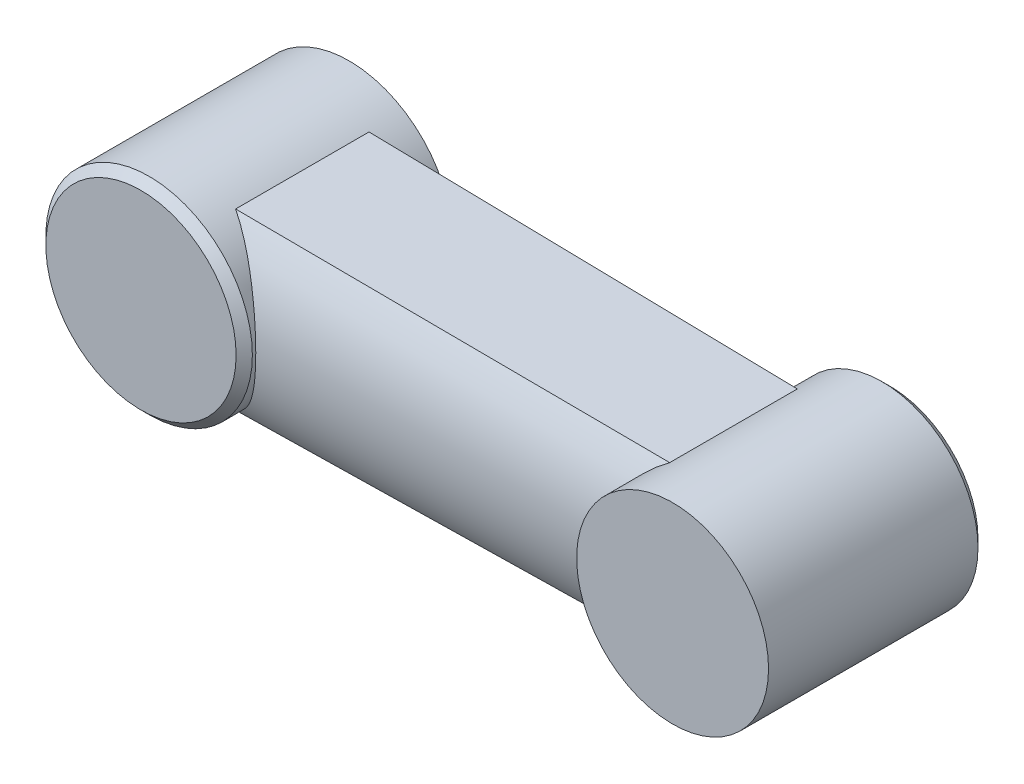
ISO-10303-21;
HEADER;
FILE_DESCRIPTION(('STEP AP214'),'2;1');
FILE_NAME('part.step','',(''),(''),'','','');
FILE_SCHEMA(('AUTOMOTIVE_DESIGN { 1 0 10303 214 1 1 1 1 }'));
ENDSEC;
DATA;
#1=APPLICATION_CONTEXT('core data for automotive mechanical design processes');
#2=APPLICATION_PROTOCOL_DEFINITION('international standard','automotive_design',2000,#1);
#3=PRODUCT_CONTEXT('',#1,'mechanical');
#4=PRODUCT('Part','Part','',(#3));
#5=PRODUCT_RELATED_PRODUCT_CATEGORY('part','',(#4));
#6=PRODUCT_DEFINITION_FORMATION('','',#4);
#7=PRODUCT_DEFINITION_CONTEXT('part definition',#1,'design');
#8=PRODUCT_DEFINITION('design','',#6,#7);
#9=PRODUCT_DEFINITION_SHAPE('','',#8);
#10=(LENGTH_UNIT() NAMED_UNIT(*) SI_UNIT(.MILLI.,.METRE.));
#11=(NAMED_UNIT(*) PLANE_ANGLE_UNIT() SI_UNIT($,.RADIAN.));
#12=(NAMED_UNIT(*) SI_UNIT($,.STERADIAN.) SOLID_ANGLE_UNIT());
#13=UNCERTAINTY_MEASURE_WITH_UNIT(LENGTH_MEASURE(1.E-05),#10,'distance_accuracy_value','');
#14=(GEOMETRIC_REPRESENTATION_CONTEXT(3) GLOBAL_UNCERTAINTY_ASSIGNED_CONTEXT((#13)) GLOBAL_UNIT_ASSIGNED_CONTEXT((#10,
#11,#12)) REPRESENTATION_CONTEXT('',''));
#15=CARTESIAN_POINT('',(0.,0.,0.));
#16=DIRECTION('',(0.,0.,1.));
#17=DIRECTION('',(1.,0.,0.));
#18=AXIS2_PLACEMENT_3D('',#15,#16,#17);
#19=CARTESIAN_POINT('',(0.,0.,-64.));
#20=DIRECTION('',(0.,0.,1.));
#21=DIRECTION('',(1.,0.,0.));
#22=AXIS2_PLACEMENT_3D('',#19,#20,#21);
#23=CYLINDRICAL_SURFACE('',#22,63.5);
#24=CARTESIAN_POINT('',(34.0875255524054,53.5750931097101,39.901123866366));
#25=CARTESIAN_POINT('',(34.8728416986949,53.0754082126081,40.2513861308099));
#26=CARTESIAN_POINT('',(35.6457519080938,52.5594024243077,40.606091688955));
#27=CARTESIAN_POINT('',(37.1664097322269,51.4953385414538,41.3217037799095));
#28=CARTESIAN_POINT('',(37.9141538902584,50.9472760718072,41.6826111543731));
#29=CARTESIAN_POINT('',(39.3840003749915,49.8197589503546,42.4078866666959));
#30=CARTESIAN_POINT('',(40.1060996697642,49.2403006070105,42.7722552073483));
#31=CARTESIAN_POINT('',(41.5240710890381,48.0505788313802,43.5018749105887));
#32=CARTESIAN_POINT('',(42.2199418112517,47.440313756108,43.86712611926));
#33=CARTESIAN_POINT('',(43.5905788765682,46.1842268316749,44.5991250340391));
#34=CARTESIAN_POINT('',(44.2651167639583,45.5381477669228,44.9658592435023));
#35=CARTESIAN_POINT('',(45.5860892461545,44.2157422798574,45.6952795922591));
#36=CARTESIAN_POINT('',(46.2325250074313,43.539417115376,46.0579658991088));
#37=CARTESIAN_POINT('',(47.4964560160919,42.1570128936726,46.7769558271872));
#38=CARTESIAN_POINT('',(48.1139522343661,41.4509348361395,47.1332596622928));
#39=CARTESIAN_POINT('',(49.319066591246,40.0095269998632,47.8372223998747));
#40=CARTESIAN_POINT('',(49.9066832170932,39.2741957434273,48.1848808641945));
#41=CARTESIAN_POINT('',(51.2438160286542,37.5221418648575,48.9846769921688));
#42=CARTESIAN_POINT('',(51.981148980518,36.4941088301045,49.4325362899803));
#43=CARTESIAN_POINT('',(53.3974608791348,34.3885306809019,50.3035128798274));
#44=CARTESIAN_POINT('',(54.0764394625069,33.3109852581957,50.7266300177848));
#45=CARTESIAN_POINT('',(55.3728334979026,31.1083957418215,51.5430185547397));
#46=CARTESIAN_POINT('',(55.9902447241766,29.9833483953351,51.9362879046565));
#47=CARTESIAN_POINT('',(57.1579385592235,27.6923712710274,52.6866555252858));
#48=CARTESIAN_POINT('',(57.7084391436257,26.5265910933806,53.0438705682438));
#49=CARTESIAN_POINT('',(58.7410229998343,24.1540044684972,53.7188075238164));
#50=CARTESIAN_POINT('',(59.2231088473443,22.9471995678961,54.0365309231713));
#51=CARTESIAN_POINT('',(60.115132294801,20.4968357103244,54.6279143533773));
#52=CARTESIAN_POINT('',(60.5250826100022,19.2532832760284,54.9015821491379));
#53=CARTESIAN_POINT('',(61.2258622697177,16.8816161027678,55.3715728935259));
#54=CARTESIAN_POINT('',(61.525015262513,15.7570053325782,55.5731979778693));
#55=CARTESIAN_POINT('',(62.0621728229516,13.486916106815,55.9363977060914));
#56=CARTESIAN_POINT('',(62.3001809188063,12.3414388593749,56.097974660827));
#57=CARTESIAN_POINT('',(62.7131653994027,10.0340665499779,56.3789845577492));
#58=CARTESIAN_POINT('',(62.8881428616507,8.87217176903093,56.4984182203731));
#59=CARTESIAN_POINT('',(63.1735457868664,6.53726220383556,56.6935033016067));
#60=CARTESIAN_POINT('',(63.2839959771694,5.36425185450201,56.7691714913633));
#61=CARTESIAN_POINT('',(63.4394854659217,3.01186006858332,56.8757573253076));
#62=CARTESIAN_POINT('',(63.4845232653367,1.8324784866124,56.9066739439383));
#63=CARTESIAN_POINT('',(63.5087682476126,-0.527139116364375,56.9233119378628));
#64=CARTESIAN_POINT('',(63.4879875060654,-1.70737494092318,56.9090416035137));
#65=CARTESIAN_POINT('',(63.4002337064968,-3.63687157900486,56.8488524992791));
#66=CARTESIAN_POINT('',(63.3527004538892,-4.38751712806003,56.8162570739209));
#67=CARTESIAN_POINT('',(63.2311090477269,-5.88570885248637,56.7329572454605));
#68=CARTESIAN_POINT('',(63.1570497737252,-6.63325489558636,56.6822520774113));
#69=CARTESIAN_POINT('',(62.9826851444603,-8.12368498947119,56.5630264041146));
#70=CARTESIAN_POINT('',(62.8823851271871,-8.8665699569932,56.4945095222105));
#71=CARTESIAN_POINT('',(62.6558690730822,-10.3466216662594,56.3400262572309));
#72=CARTESIAN_POINT('',(62.5296506008793,-11.0837878638919,56.2540582344057));
#73=CARTESIAN_POINT('',(62.2517639874001,-12.5509021782115,56.0651662741838));
#74=CARTESIAN_POINT('',(62.1001027544092,-13.2808521974362,55.9622469395897));
#75=CARTESIAN_POINT('',(61.7717823488949,-14.7326459947485,55.7399698208164));
#76=CARTESIAN_POINT('',(61.5951208447076,-15.4544890099463,55.6206105033809));
#77=CARTESIAN_POINT('',(61.217360617399,-16.8888935764164,55.3660773293602));
#78=CARTESIAN_POINT('',(61.0162632656874,-17.6014556460789,55.230904360298));
#79=CARTESIAN_POINT('',(60.5902141352028,-19.0163631609896,54.9454158803474));
#80=CARTESIAN_POINT('',(60.3652601789072,-19.7187076669599,54.7950989872529));
#81=CARTESIAN_POINT('',(59.6505318221485,-21.8237160402855,54.3191757414114));
#82=CARTESIAN_POINT('',(59.1248403438077,-23.2093914608956,53.9712705511763));
#83=CARTESIAN_POINT('',(57.9839729159312,-25.9284336527049,53.2230967705003));
#84=CARTESIAN_POINT('',(57.3687970007416,-27.2618004439809,52.8228282001576));
#85=CARTESIAN_POINT('',(56.0538397553098,-29.8723003374955,51.9766071094194));
#86=CARTESIAN_POINT('',(55.3539988997473,-31.1493930043824,51.5306224815));
#87=CARTESIAN_POINT('',(53.875253481758,-33.6423535704149,50.6005567398079));
#88=CARTESIAN_POINT('',(53.0963459251374,-34.8582191483283,50.1164741834528));
#89=CARTESIAN_POINT('',(51.3456749882489,-37.3976306123661,49.0452170990712));
#90=CARTESIAN_POINT('',(50.362328904306,-38.7111906318219,48.4532775492336));
#91=CARTESIAN_POINT('',(48.3041804975155,-41.2507998557215,47.2408083664554));
#92=CARTESIAN_POINT('',(47.2293600646791,-42.4768316426624,46.6202730833662));
#93=CARTESIAN_POINT('',(44.994490314296,-44.8373219798834,45.3632472705436));
#94=CARTESIAN_POINT('',(43.8345163997063,-45.9718597229656,44.7267711776823));
#95=CARTESIAN_POINT('',(41.4328631634707,-48.1476068236405,43.4500731763614));
#96=CARTESIAN_POINT('',(40.1912167096048,-49.1888533310852,42.8098528680654));
#97=CARTESIAN_POINT('',(38.1344220294306,-50.7836565269925,41.7896281964514));
#98=CARTESIAN_POINT('',(37.3441695215727,-51.3676107876423,41.4065671168528));
#99=CARTESIAN_POINT('',(35.7364145272882,-52.4987853172949,40.6477365047195));
#100=CARTESIAN_POINT('',(34.9189537613392,-53.0460582705289,40.2719570906765));
#101=CARTESIAN_POINT('',(34.0875255524053,-53.5750931097102,39.901123866366));
#102=B_SPLINE_CURVE_WITH_KNOTS('',3,(#24,#25,#26,#27,#28,#29,#30,#31,#32,#33,#34,#35,#36,#37,
#38,#39,#40,#41,#42,#43,#44,#45,#46,#47,#48,#49,#50,#51,#52,#53,#54,#55,#56,#57,#58,#59,#60,#61,
#62,#63,#64,#65,#66,#67,#68,#69,#70,#71,#72,#73,#74,#75,#76,#77,#78,#79,#80,#81,#82,#83,#84,#85,
#86,#87,#88,#89,#90,#91,#92,#93,#94,#95,#96,#97,#98,#99,#100,#101),.UNSPECIFIED.,.F.,.F.,(4,2,2,
2,2,2,2,2,2,2,2,2,2,2,2,2,2,2,2,2,2,2,2,2,2,2,2,2,2,2,2,2,2,2,2,2,2,2,4),(0.,2.98332471583376,
5.9670575499503,8.95114197701182,11.9353857198915,14.9448859745384,17.9542611905267,
20.9635353728338,23.9729617587502,27.9966721819526,32.0204076595553,36.0444191212616,
40.0549486332554,44.0653271152617,48.0749979823765,51.615830095113,55.1564578471892,
58.6970250695027,62.236234628405,65.775525292925,69.3141666487019,71.572109037435,
73.8301468118697,76.0877256044928,78.3455166227259,80.6026955888813,82.8600852109935,
85.1173482004254,87.374817400205,91.9367374731447,96.4986557951226,101.063800307899,
105.629117763649,110.857075639126,116.086070958338,121.310490620102,126.532820512648,
129.695776881275,132.854088479412),.UNSPECIFIED.);
#103=CARTESIAN_POINT('',(34.0875255524053,53.5750931097102,39.901123866366));
#104=VERTEX_POINT('',#103);
#105=CARTESIAN_POINT('',(34.0875255524053,-53.5750931097102,39.901123866366));
#106=VERTEX_POINT('',#105);
#107=EDGE_CURVE('E115',#104,#106,#102,.T.);
#108=ORIENTED_EDGE('',*,*,#107,.F.);
#109=DIRECTION('',(0.,0.,1.));
#110=VECTOR('',#109,1.);
#111=CARTESIAN_POINT('',(34.0875255524053,53.5750931097102,-64.));
#112=LINE('',#111,#110);
#113=CARTESIAN_POINT('',(34.0875255524053,53.5750931097102,-42.1394140955174));
#114=VERTEX_POINT('',#113);
#115=EDGE_CURVE('E183',#114,#104,#112,.T.);
#116=ORIENTED_EDGE('',*,*,#115,.F.);
#117=CARTESIAN_POINT('',(34.0875255524053,-53.5750931097102,-42.1394140955174));
#118=CARTESIAN_POINT('',(34.6070489229823,-53.2445389100125,-42.334882637009));
#119=CARTESIAN_POINT('',(35.1212066458949,-52.9067901087874,-42.5323149785162));
#120=CARTESIAN_POINT('',(36.1386321395676,-52.2171147666792,-42.9304152603627));
#121=CARTESIAN_POINT('',(36.6419001026892,-51.8651884765483,-43.1310831434385));
#122=CARTESIAN_POINT('',(38.1351016788967,-50.7884837174418,-43.7368895161274));
#123=CARTESIAN_POINT('',(39.1084924729786,-50.0427414803527,-44.1458532583939));
#124=CARTESIAN_POINT('',(41.0093265129066,-48.4972761823509,-44.9684663432524));
#125=CARTESIAN_POINT('',(41.9367674916235,-47.6975504625237,-45.3821159158052));
#126=CARTESIAN_POINT('',(43.749328007172,-46.0408786286366,-46.2113657781002));
#127=CARTESIAN_POINT('',(44.6341674583531,-45.1836244548227,-46.6269632817289));
#128=CARTESIAN_POINT('',(46.353723463192,-43.4177508485522,-47.4526135878866));
#129=CARTESIAN_POINT('',(47.1884411616891,-42.5091325902324,-47.8626665168941));
#130=CARTESIAN_POINT('',(48.8056823815175,-40.6421045934075,-48.6723824447514));
#131=CARTESIAN_POINT('',(49.5882046786395,-39.6836936879853,-49.0720451997722));
#132=CARTESIAN_POINT('',(51.10008183092,-37.7170102166117,-49.8569829386807));
#133=CARTESIAN_POINT('',(51.8293348289539,-36.7086480103418,-50.2422297054705));
#134=CARTESIAN_POINT('',(53.2304447984961,-34.645698070553,-50.9929332933545));
#135=CARTESIAN_POINT('',(53.9023019694719,-33.5911104977002,-51.3583901832229));
#136=CARTESIAN_POINT('',(55.185822954392,-31.4379676181106,-52.0650509138601));
#137=CARTESIAN_POINT('',(55.7974840153661,-30.3394103037188,-52.406253645207));
#138=CARTESIAN_POINT('',(56.9562091304579,-28.1037645870805,-53.0592848837396));
#139=CARTESIAN_POINT('',(57.5034226278785,-26.9667735209178,-53.3711809941749));
#140=CARTESIAN_POINT('',(58.5318499461043,-24.6550776536046,-53.9623971004071));
#141=CARTESIAN_POINT('',(59.0130651954082,-23.4803736694105,-54.2417178012626));
#142=CARTESIAN_POINT('',(59.9064149385316,-21.0971682630229,-54.7639190421848));
#143=CARTESIAN_POINT('',(60.3185572449597,-19.8886706811762,-55.0068037030831));
#144=CARTESIAN_POINT('',(61.0390031347694,-17.5459962606881,-55.4337629932465));
#145=CARTESIAN_POINT('',(61.3531476101824,-16.4142039156255,-55.6210776527687));
#146=CARTESIAN_POINT('',(61.919149260359,-14.1298761044509,-55.9599302603612));
#147=CARTESIAN_POINT('',(62.171008736096,-12.9773414063046,-56.11146953006));
#148=CARTESIAN_POINT('',(62.6106951459703,-10.6558212320018,-56.3767999025606));
#149=CARTESIAN_POINT('',(62.798522743702,-9.48683592646204,-56.4905913965612));
#150=CARTESIAN_POINT('',(63.1087130702369,-7.13748270439034,-56.6788684563125));
#151=CARTESIAN_POINT('',(63.2310995156664,-5.95711906959384,-56.7533682616893));
#152=CARTESIAN_POINT('',(63.4095790243943,-3.5895315952493,-56.8621065574091));
#153=CARTESIAN_POINT('',(63.4656709782761,-2.40230764123016,-56.8963443739808));
#154=CARTESIAN_POINT('',(63.5111074825608,-0.026216978466881,-56.9240728449856));
#155=CARTESIAN_POINT('',(63.5004621155403,1.16264945500151,-56.9175696545104));
#156=CARTESIAN_POINT('',(63.4277254825092,3.12719441421199,-56.8731961269407));
#157=CARTESIAN_POINT('',(63.3846508301167,3.90391299862703,-56.8469219329064));
#158=CARTESIAN_POINT('',(63.2700744515998,5.45453579386688,-56.7771111321624));
#159=CARTESIAN_POINT('',(63.1985714170876,6.22843987350235,-56.7335737309313));
#160=CARTESIAN_POINT('',(63.0273871875162,7.77182349366952,-56.6295001546979));
#161=CARTESIAN_POINT('',(62.9277110913236,8.54130380914185,-56.5689670556541));
#162=CARTESIAN_POINT('',(62.7004864068519,10.0747106236825,-56.4312452584072));
#163=CARTESIAN_POINT('',(62.572935193039,10.8386365925835,-56.3540549912881));
#164=CARTESIAN_POINT('',(62.2904038340495,12.359349678884,-56.1834879521289));
#165=CARTESIAN_POINT('',(62.1354313708006,13.1161387332754,-56.0901157135384));
#166=CARTESIAN_POINT('',(61.7984867967,14.6216320434426,-55.8876863540519));
#167=CARTESIAN_POINT('',(61.6165121487069,15.3703355323943,-55.7786277592862));
#168=CARTESIAN_POINT('',(61.226106887471,16.8583930857653,-55.5454357010636));
#169=CARTESIAN_POINT('',(61.017677972192,17.5977477468917,-55.4213032051452));
#170=CARTESIAN_POINT('',(60.5749313006101,19.0660950723717,-55.1586275676271));
#171=CARTESIAN_POINT('',(60.3406111691493,19.7950867791338,-55.0200831039987));
#172=CARTESIAN_POINT('',(59.5967562962069,21.9736183939978,-54.5821587610005));
#173=CARTESIAN_POINT('',(59.0486105909326,23.4060311715217,-54.2618600672826));
#174=CARTESIAN_POINT('',(57.8552921107319,26.2173255581269,-53.5723484643377));
#175=CARTESIAN_POINT('',(57.2101194122757,27.5962072093969,-53.2031355936617));
#176=CARTESIAN_POINT('',(55.8274837212358,30.2959362902032,-52.4225474923739));
#177=CARTESIAN_POINT('',(55.0899465183107,31.6167358875834,-52.0111384078368));
#178=CARTESIAN_POINT('',(53.528225656365,34.1943017388064,-51.1539620840156));
#179=CARTESIAN_POINT('',(52.7040392913014,35.4510659910123,-50.708193771813));
#180=CARTESIAN_POINT('',(50.8662899873879,38.0487403824544,-49.7330661572848));
#181=CARTESIAN_POINT('',(49.8419211306735,39.3806994953773,-49.2002029677461));
#182=CARTESIAN_POINT('',(47.6957644418796,41.9544091195498,-48.1124396922618));
#183=CARTESIAN_POINT('',(46.5739563529866,43.196140774239,-47.5575350371523));
#184=CARTESIAN_POINT('',(44.2399998519241,45.5835042025916,-46.4385898174968));
#185=CARTESIAN_POINT('',(43.0279707709924,46.7292588005649,-45.8745620666235));
#186=CARTESIAN_POINT('',(40.5173174024619,48.9221124661703,-44.749480926731));
#187=CARTESIAN_POINT('',(39.2187356476239,49.9692593889151,-44.188426220939));
#188=CARTESIAN_POINT('',(37.2638797458986,51.4221818244556,-43.3817245133034));
#189=CARTESIAN_POINT('',(36.6400722353196,51.8685334804043,-43.1296079661983));
#190=CARTESIAN_POINT('',(35.3761310866709,52.7386673262228,-42.6304533808489));
#191=CARTESIAN_POINT('',(34.7360175493161,53.1624754870219,-42.3834097092511));
#192=CARTESIAN_POINT('',(34.0875255524053,53.5750931097102,-42.1394140955174));
#193=B_SPLINE_CURVE_WITH_KNOTS('',3,(#117,#118,#119,#120,#121,#122,#123,#124,#125,#126,#127,
#128,#129,#130,#131,#132,#133,#134,#135,#136,#137,#138,#139,#140,#141,#142,#143,#144,#145,#146,
#147,#148,#149,#150,#151,#152,#153,#154,#155,#156,#157,#158,#159,#160,#161,#162,#163,#164,#165,
#166,#167,#168,#169,#170,#171,#172,#173,#174,#175,#176,#177,#178,#179,#180,#181,#182,#183,#184,
#185,#186,#187,#188,#189,#190,#191,#192),.UNSPECIFIED.,.F.,.F.,(4,2,2,2,2,2,2,2,2,2,2,2,2,2,2,2,
2,2,2,2,2,2,2,2,2,2,2,2,2,2,2,2,2,2,2,2,2,4),(0.,1.93800436682585,3.87597447190296,
7.75169287544148,11.6276023139586,15.526241635063,19.4247918727818,23.3234335163332,
27.2293446012244,31.1352421113665,35.0413181683906,38.9381504973661,42.8348984680657,
46.7312053928081,50.2972087641048,53.8630803780728,57.4289150360019,60.9934565170458,
64.5580576486748,68.1221202585612,70.4565380045493,72.7910632022114,75.1251661589724,
77.4594890577444,79.793159039877,82.1270484340473,84.4607881035007,86.7947420390453,
91.4898205633479,96.1848953873174,100.883766970143,105.582785341777,110.865742160623,
116.149799903439,121.426988769977,126.701603230317,129.123447786643,131.542439016917),.UNSPECIFIED.);
#194=CARTESIAN_POINT('',(34.0875255524053,-53.5750931097102,-42.1394140955174));
#195=VERTEX_POINT('',#194);
#196=EDGE_CURVE('E100',#195,#114,#193,.T.);
#197=ORIENTED_EDGE('',*,*,#196,.F.);
#198=DIRECTION('',(0.,0.,1.));
#199=VECTOR('',#198,1.);
#200=CARTESIAN_POINT('',(34.0875255524053,-53.5750931097102,-64.));
#201=LINE('',#200,#199);
#202=EDGE_CURVE('E119',#106,#195,#201,.F.);
#203=ORIENTED_EDGE('',*,*,#202,.F.);
#204=EDGE_LOOP('',(#108,#116,#197,#203));
#205=FACE_BOUND('',#204,.T.);
#206=CARTESIAN_POINT('',(0.,0.,59.));
#207=DIRECTION('',(0.,0.,1.));
#208=DIRECTION('',(1.,0.,0.));
#209=AXIS2_PLACEMENT_3D('',#206,#207,#208);
#210=CIRCLE('',#209,63.5);
#211=CARTESIAN_POINT('',(63.5,0.,59.));
#212=VERTEX_POINT('',#211);
#213=EDGE_CURVE('E175',#212,#212,#210,.F.);
#214=ORIENTED_EDGE('',*,*,#213,.T.);
#215=EDGE_LOOP('',(#214));
#216=FACE_BOUND('',#215,.T.);
#217=CARTESIAN_POINT('',(0.,0.,-64.));
#218=DIRECTION('',(0.,0.,1.));
#219=DIRECTION('',(1.,0.,0.));
#220=AXIS2_PLACEMENT_3D('',#217,#218,#219);
#221=CIRCLE('',#220,63.5);
#222=CARTESIAN_POINT('',(63.5,0.,-64.));
#223=VERTEX_POINT('',#222);
#224=EDGE_CURVE('E103',#223,#223,#221,.T.);
#225=ORIENTED_EDGE('',*,*,#224,.T.);
#226=EDGE_LOOP('',(#225));
#227=FACE_BOUND('',#226,.T.);
#228=ADVANCED_FACE('F50',(#205,#216,#227),#23,.T.);
#229=CARTESIAN_POINT('',(0.,0.,-64.));
#230=DIRECTION('',(0.,0.,1.));
#231=DIRECTION('',(1.,0.,0.));
#232=AXIS2_PLACEMENT_3D('',#229,#230,#231);
#233=PLANE('',#232);
#234=ORIENTED_EDGE('',*,*,#224,.F.);
#235=EDGE_LOOP('',(#234));
#236=FACE_BOUND('',#235,.T.);
#237=ADVANCED_FACE('F187',(#236),#233,.F.);
#238=CARTESIAN_POINT('',(0.,0.,64.));
#239=DIRECTION('',(0.,0.,1.));
#240=DIRECTION('',(1.,0.,0.));
#241=AXIS2_PLACEMENT_3D('',#238,#239,#240);
#242=PLANE('',#241);
#243=CARTESIAN_POINT('',(0.,0.,64.));
#244=DIRECTION('',(0.,0.,1.));
#245=DIRECTION('',(1.,0.,0.));
#246=AXIS2_PLACEMENT_3D('',#243,#244,#245);
#247=CIRCLE('',#246,58.5);
#248=CARTESIAN_POINT('',(58.5,0.,64.));
#249=VERTEX_POINT('',#248);
#250=EDGE_CURVE('E172',#249,#249,#247,.T.);
#251=ORIENTED_EDGE('',*,*,#250,.T.);
#252=EDGE_LOOP('',(#251));
#253=FACE_BOUND('',#252,.T.);
#254=ADVANCED_FACE('F195',(#253),#242,.T.);
#255=CARTESIAN_POINT('',(0.,0.,64.));
#256=DIRECTION('',(0.,0.,-1.));
#257=DIRECTION('',(-1.,0.,0.));
#258=AXIS2_PLACEMENT_3D('',#255,#256,#257);
#259=CONICAL_SURFACE('',#258,58.5,0.785398163397448);
#260=ORIENTED_EDGE('',*,*,#213,.F.);
#261=EDGE_LOOP('',(#260));
#262=FACE_BOUND('',#261,.T.);
#263=ORIENTED_EDGE('',*,*,#250,.F.);
#264=EDGE_LOOP('',(#263));
#265=FACE_BOUND('',#264,.T.);
#266=ADVANCED_FACE('F190',(#262,#265),#259,.T.);
#267=CARTESIAN_POINT('',(0.,54.,40.1203836734958));
#268=CARTESIAN_POINT('',(330.2,49.884,37.9964516150382));
#269=CARTESIAN_POINT('',(0.,20.639458431767,64.4313532901268));
#270=CARTESIAN_POINT('',(330.2,18.8682198581626,59.4920387123253));
#271=CARTESIAN_POINT('',(0.,-20.639458431767,64.4313532901268));
#272=CARTESIAN_POINT('',(330.2,-18.8682198581626,59.4920387123253));
#273=CARTESIAN_POINT('',(0.,-54.,40.1203836734958));
#274=CARTESIAN_POINT('',(330.2,-49.884,37.9964516150382));
#275=(BOUNDED_SURFACE() B_SPLINE_SURFACE(3,1,((#267,#268),(#269,#270),(#271,#272),(#273,#274)),
.UNSPECIFIED.,.F.,.F.,.F.) B_SPLINE_SURFACE_WITH_KNOTS((4,4),(2,2),(0.,1.),(0.,1.),
.UNSPECIFIED.) GEOMETRIC_REPRESENTATION_ITEM() RATIONAL_B_SPLINE_SURFACE(((1.,1.),
(0.87211590650535,0.881270205933418),(0.87211590650535,0.881270205933418),(1.,1.))) REPRESENTATION_ITEM('') SURFACE());
#276=CARTESIAN_POINT('',(299.312687676527,50.2690156799619,38.1951268204998));
#277=CARTESIAN_POINT('',(298.820120806813,49.9663578347433,38.4134000794214));
#278=CARTESIAN_POINT('',(298.332612658844,49.656844969285,38.633477572108));
#279=CARTESIAN_POINT('',(297.367809237707,49.02428085137,39.0765154992185));
#280=CARTESIAN_POINT('',(296.890513785287,48.7012298368274,39.2994758829322));
#281=CARTESIAN_POINT('',(295.473998333577,47.7119649212693,39.9716358587943));
#282=CARTESIAN_POINT('',(294.550217685801,47.0256812361216,40.4240837551873));
#283=CARTESIAN_POINT('',(292.745175404169,45.6010775788342,41.3319625019481));
#284=CARTESIAN_POINT('',(291.863917758554,44.8627527416653,41.7873936275813));
#285=CARTESIAN_POINT('',(290.13834707711,43.3290564407837,42.6996508279235));
#286=CARTESIAN_POINT('',(289.29439257469,42.533270054574,43.1564581497346));
#287=CARTESIAN_POINT('',(287.652901578261,40.8912220733986,44.0625494508173));
#288=CARTESIAN_POINT('',(286.855362717034,40.0449630570236,44.5118338129291));
#289=CARTESIAN_POINT('',(285.308666103534,38.3030642954282,45.3979438127693));
#290=CARTESIAN_POINT('',(284.559509445695,37.4074234340116,45.8347691685432));
#291=CARTESIAN_POINT('',(283.11004864772,35.5656205835682,46.6922408527991));
#292=CARTESIAN_POINT('',(282.40987965422,34.6193306336959,47.1128410899132));
#293=CARTESIAN_POINT('',(281.063319625469,32.6799658122892,47.931836764835));
#294=CARTESIAN_POINT('',(280.416928804059,31.6868907547458,48.3302321143463));
#295=CARTESIAN_POINT('',(279.180927785604,29.6558177270077,49.1001237017089));
#296=CARTESIAN_POINT('',(278.591321426935,28.6178167268845,49.4716181207571));
#297=CARTESIAN_POINT('',(277.474005075588,26.5027413370472,50.1819244200731));
#298=CARTESIAN_POINT('',(276.946104836484,25.4258012092224,50.5208361499374));
#299=CARTESIAN_POINT('',(275.953485570861,23.2328253375399,51.1628493162913));
#300=CARTESIAN_POINT('',(275.488764219942,22.1167910338886,51.4659520701675));
#301=CARTESIAN_POINT('',(274.62600163408,19.8494707663928,52.0320943547575));
#302=CARTESIAN_POINT('',(274.22794926837,18.6981907250644,52.2951405724713));
#303=CARTESIAN_POINT('',(273.542763867682,16.4964495577758,52.7501192120954));
#304=CARTESIAN_POINT('',(273.248183588365,15.4492670077206,52.9467264785171));
#305=CARTESIAN_POINT('',(272.716216319856,13.334294822864,53.3029716022107));
#306=CARTESIAN_POINT('',(272.478826174298,12.2665063288353,53.4626114997212));
#307=CARTESIAN_POINT('',(272.063098455218,10.1144313514259,53.7428737780346));
#308=CARTESIAN_POINT('',(271.884760090293,9.03014508934996,53.8634966817379));
#309=CARTESIAN_POINT('',(271.588690376203,6.85009466131849,54.0640721958229));
#310=CARTESIAN_POINT('',(271.470930692282,5.75433610651894,54.1440438200152));
#311=CARTESIAN_POINT('',(271.296916452338,3.55569153106458,54.262308461463));
#312=CARTESIAN_POINT('',(271.240663146647,2.45280536597458,54.3006006314377));
#313=CARTESIAN_POINT('',(271.190182607052,0.245091326751467,54.3349597428531));
#314=CARTESIAN_POINT('',(271.195943690633,-0.859736142462828,54.3310346373507));
#315=CARTESIAN_POINT('',(271.256049562939,-2.66558563354039,54.2901316015457));
#316=CARTESIAN_POINT('',(271.291996265653,-3.36758385381328,54.265671141915));
#317=CARTESIAN_POINT('',(271.388871271417,-4.76911401235845,54.1998062701185));
#318=CARTESIAN_POINT('',(271.449800627507,-5.46864584541663,54.1584011437204));
#319=CARTESIAN_POINT('',(271.596410677616,-6.86376182540017,54.0588862164579));
#320=CARTESIAN_POINT('',(271.682086330823,-7.55934674691621,54.0007798176487));
#321=CARTESIAN_POINT('',(271.877902893667,-8.94555803867696,53.8681739833133));
#322=CARTESIAN_POINT('',(271.988046121262,-9.63618393272014,53.7936729946368));
#323=CARTESIAN_POINT('',(272.232388194927,-11.0110560172365,53.6287055691793));
#324=CARTESIAN_POINT('',(272.366580869766,-11.6953037970957,53.5382432282671));
#325=CARTESIAN_POINT('',(272.658613480961,-13.0565490911452,53.3418112392498));
#326=CARTESIAN_POINT('',(272.816455656163,-13.7335459123942,53.2358401229843));
#327=CARTESIAN_POINT('',(273.155277081082,-15.0791535663315,53.0089474262153));
#328=CARTESIAN_POINT('',(273.336254945411,-15.7477648985211,52.8880267409216));
#329=CARTESIAN_POINT('',(273.720811956228,-17.0756949541013,52.6318395421638));
#330=CARTESIAN_POINT('',(273.924393175295,-17.7350128190859,52.4965717132128));
#331=CARTESIAN_POINT('',(274.569750220916,-19.7023893200417,52.0691858278858));
#332=CARTESIAN_POINT('',(275.044958137382,-20.9951945555455,51.7562800957339));
#333=CARTESIAN_POINT('',(276.079148768671,-23.5332142247924,51.0811399121009));
#334=CARTESIAN_POINT('',(276.638130973782,-24.7784289480348,50.7189057607522));
#335=CARTESIAN_POINT('',(277.83526770372,-27.2172933061357,49.9511387908823));
#336=CARTESIAN_POINT('',(278.47346969722,-28.4109114411095,49.5455800326443));
#337=CARTESIAN_POINT('',(279.823902148166,-30.7418849759217,48.6979513969692));
#338=CARTESIAN_POINT('',(280.536135663972,-31.8792380484951,48.2558800112933));
#339=CARTESIAN_POINT('',(282.133986752992,-34.2487097990162,47.2784630114741));
#340=CARTESIAN_POINT('',(283.02994489474,-35.4720373390486,46.7386920376435));
#341=CARTESIAN_POINT('',(284.906287261798,-37.8386142499545,45.6307013195817));
#342=CARTESIAN_POINT('',(285.886686434614,-38.9818493778844,45.062476546025));
#343=CARTESIAN_POINT('',(287.926249615067,-41.184729425972,43.9084603714603));
#344=CARTESIAN_POINT('',(288.985367571049,-42.2444224832408,43.3226793589708));
#345=CARTESIAN_POINT('',(291.178518409908,-44.2782104360038,42.144263720143));
#346=CARTESIAN_POINT('',(292.31252610327,-45.2523338589487,41.5516314530284));
#347=CARTESIAN_POINT('',(294.410671313402,-46.9204621095445,40.4928809665539));
#348=CARTESIAN_POINT('',(295.361474472024,-47.6307497053919,40.02593092383));
#349=CARTESIAN_POINT('',(296.819719451061,-48.6529382250736,39.332675598009));
#350=CARTESIAN_POINT('',(297.310692806757,-48.9861849116742,39.1029854285058));
#351=CARTESIAN_POINT('',(298.303551868008,-49.6383855913537,38.6466005351544));
#352=CARTESIAN_POINT('',(298.805439538141,-49.9573369791174,38.4199063625918));
#353=CARTESIAN_POINT('',(299.312687676527,-50.2690156799619,38.1951268204998));
#354=B_SPLINE_CURVE_WITH_KNOTS('',3,(#276,#277,#278,#279,#280,#281,#282,#283,#284,#285,#286,
#287,#288,#289,#290,#291,#292,#293,#294,#295,#296,#297,#298,#299,#300,#301,#302,#303,#304,#305,
#306,#307,#308,#309,#310,#311,#312,#313,#314,#315,#316,#317,#318,#319,#320,#321,#322,#323,#324,
#325,#326,#327,#328,#329,#330,#331,#332,#333,#334,#335,#336,#337,#338,#339,#340,#341,#342,#343,
#344,#345,#346,#347,#348,#349,#350,#351,#352,#353),.UNSPECIFIED.,.F.,.F.,(4,2,2,2,2,2,2,2,2,2,2,
2,2,2,2,2,2,2,2,2,2,2,2,2,2,2,2,2,2,2,2,2,2,2,2,2,2,2,4),(0.,1.85372891395322,3.70742526484892,
7.41507546536314,11.1230727337323,14.861210620055,18.5991576923723,22.3371892895518,
26.0851568490709,29.8331393110889,33.5813749423982,37.3177312549254,41.0539500667515,
44.7895444723798,48.1037110241561,51.4176946226063,54.7316338056733,58.0440215314276,
61.3564765918003,64.6683076497551,66.7777514228669,68.8872841200027,70.9963874087435,
73.1056905905938,75.2144532858214,77.3234157393559,79.4322519651267,81.5412817171143,
85.7739638499756,90.006620230783,94.2418251836697,98.4772051691092,103.301087881716,
108.125826265877,112.947763992438,117.768088017677,121.592112834893,123.500752146939,
125.409737905296),.UNSPECIFIED.);
#355=CARTESIAN_POINT('',(299.312687676527,50.2690156799619,38.1951268204997));
#356=VERTEX_POINT('',#355);
#357=CARTESIAN_POINT('',(299.312687676527,-50.2690156799619,38.1951268204998));
#358=VERTEX_POINT('',#357);
#359=EDGE_CURVE('E73',#356,#358,#354,.T.);
#360=DIRECTION('',(-0.999901637269904,0.0124639465142425,0.00643162671926648));
#361=VECTOR('',#360,1.);
#362=CARTESIAN_POINT('',(165.1,51.942,39.058417644267));
#363=LINE('',#362,#361);
#364=EDGE_CURVE('E109',#356,#104,#363,.T.);
#365=DIRECTION('',(0.999901637269904,0.0124639465142426,-0.00643162671926648));
#366=VECTOR('',#365,1.);
#367=CARTESIAN_POINT('',(165.1,-51.942,39.058417644267));
#368=LINE('',#367,#366);
#369=EDGE_CURVE('E168',#106,#358,#368,.T.);
#370=ORIENTED_EDGE('',*,*,#359,.F.);
#371=ORIENTED_EDGE('',*,*,#364,.T.);
#372=ORIENTED_EDGE('',*,*,#107,.T.);
#373=ORIENTED_EDGE('',*,*,#369,.T.);
#374=EDGE_LOOP('',(#370,#371,#372,#373));
#375=FACE_BOUND('',#374,.T.);
#376=ADVANCED_FACE('F147',(#375),#275,.T.);
#377=CARTESIAN_POINT('',(0.673014748235981,-53.9916107549857,0.));
#378=DIRECTION('',(0.0124642043129388,-0.999922318788237,0.));
#379=DIRECTION('',(0.999922318788237,0.0124642043129388,0.));
#380=AXIS2_PLACEMENT_3D('',#377,#378,#379);
#381=PLANE('',#380);
#382=DIRECTION('',(0.,0.,1.));
#383=VECTOR('',#382,1.);
#384=CARTESIAN_POINT('',(299.312687676527,-50.2690156799619,-66.5));
#385=LINE('',#384,#383);
#386=CARTESIAN_POINT('',(299.312687676527,-50.2690156799619,-40.2704701160511));
#387=VERTEX_POINT('',#386);
#388=EDGE_CURVE('E66',#358,#387,#385,.F.);
#389=ORIENTED_EDGE('',*,*,#388,.F.);
#390=ORIENTED_EDGE('',*,*,#369,.F.);
#391=ORIENTED_EDGE('',*,*,#202,.T.);
#392=DIRECTION('',(0.99989749799021,0.0124638949174067,0.00704590919649516));
#393=VECTOR('',#392,1.);
#394=CARTESIAN_POINT('',(0.,-54.,-42.3796163265043));
#395=LINE('',#394,#393);
#396=EDGE_CURVE('E104',#195,#387,#395,.T.);
#397=ORIENTED_EDGE('',*,*,#396,.T.);
#398=EDGE_LOOP('',(#389,#390,#391,#397));
#399=FACE_BOUND('',#398,.T.);
#400=ADVANCED_FACE('F201',(#399),#381,.T.);
#401=CARTESIAN_POINT('',(0.673014748235979,53.9916107549857,0.));
#402=DIRECTION('',(0.0124642043129387,0.999922318788237,0.));
#403=DIRECTION('',(-0.999922318788237,0.0124642043129387,0.));
#404=AXIS2_PLACEMENT_3D('',#401,#402,#403);
#405=PLANE('',#404);
#406=DIRECTION('',(0.,0.,1.));
#407=VECTOR('',#406,1.);
#408=CARTESIAN_POINT('',(299.312687676527,50.2690156799619,-66.5));
#409=LINE('',#408,#407);
#410=CARTESIAN_POINT('',(299.312687676527,50.2690156799619,-40.2704701160511));
#411=VERTEX_POINT('',#410);
#412=EDGE_CURVE('E107',#411,#356,#409,.T.);
#413=ORIENTED_EDGE('',*,*,#412,.F.);
#414=DIRECTION('',(0.99989749799021,-0.0124638949174067,0.0070459091964952));
#415=VECTOR('',#414,1.);
#416=CARTESIAN_POINT('',(165.1,51.942,-41.2162174674417));
#417=LINE('',#416,#415);
#418=EDGE_CURVE('E94',#114,#411,#417,.T.);
#419=ORIENTED_EDGE('',*,*,#418,.F.);
#420=ORIENTED_EDGE('',*,*,#115,.T.);
#421=ORIENTED_EDGE('',*,*,#364,.F.);
#422=EDGE_LOOP('',(#413,#419,#420,#421));
#423=FACE_BOUND('',#422,.T.);
#424=ADVANCED_FACE('F108',(#423),#405,.T.);
#425=CARTESIAN_POINT('',(0.,-54.,-42.3796163265043));
#426=CARTESIAN_POINT('',(330.2,-49.884,-40.0528186083791));
#427=CARTESIAN_POINT('',(0.,-19.987417175028,-63.382749209216));
#428=CARTESIAN_POINT('',(330.2,-18.3025305396578,-58.5606894569099));
#429=CARTESIAN_POINT('',(0.,19.9874171750281,-63.382749209216));
#430=CARTESIAN_POINT('',(330.2,18.3025305396578,-58.5606894569099));
#431=CARTESIAN_POINT('',(0.,54.,-42.3796163265043));
#432=CARTESIAN_POINT('',(330.2,49.884,-40.0528186083791));
#433=(BOUNDED_SURFACE() B_SPLINE_SURFACE(3,1,((#425,#426),(#427,#428),(#429,#430),(#431,#432)),
.UNSPECIFIED.,.F.,.F.,.F.) B_SPLINE_SURFACE_WITH_KNOTS((4,4),(2,2),(0.,1.),(0.,1.),
.UNSPECIFIED.) GEOMETRIC_REPRESENTATION_ITEM() RATIONAL_B_SPLINE_SURFACE(((1.,1.),
(0.900566583584842,0.908508250483209),(0.900566583584842,0.908508250483209),(1.,1.))) REPRESENTATION_ITEM('') SURFACE());
#434=CARTESIAN_POINT('',(299.312687676527,-50.2690156799619,-40.2704701160511));
#435=CARTESIAN_POINT('',(298.335975569884,-49.6688535816304,-40.6381371659844));
#436=CARTESIAN_POINT('',(297.378705086664,-49.041484377802,-41.0128156425435));
#437=CARTESIAN_POINT('',(295.504602658758,-47.7340097673958,-41.7713215289791));
#438=CARTESIAN_POINT('',(294.587771850855,-47.0539028798147,-42.1551491955776));
#439=CARTESIAN_POINT('',(292.79611819661,-45.6426325860991,-42.9270759674216));
#440=CARTESIAN_POINT('',(291.921297271237,-44.911466848962,-43.3151752669988));
#441=CARTESIAN_POINT('',(290.210543880902,-43.3953582120682,-44.0931929433399));
#442=CARTESIAN_POINT('',(289.374858709243,-42.6101351414452,-44.4831092273449));
#443=CARTESIAN_POINT('',(287.749527949137,-40.9911341227182,-45.2580118428076));
#444=CARTESIAN_POINT('',(286.959881401725,-40.1573571866943,-45.6429982768216));
#445=CARTESIAN_POINT('',(285.428602760093,-38.4427260185084,-46.4036595786873));
#446=CARTESIAN_POINT('',(284.686971770081,-37.5618707045413,-46.7793342322747));
#447=CARTESIAN_POINT('',(283.252700504592,-35.7531195834613,-47.5177330120793));
#448=CARTESIAN_POINT('',(282.560149172866,-34.8251433536802,-47.8804330647161));
#449=CARTESIAN_POINT('',(281.227936846617,-32.9254144080206,-48.5879801266821));
#450=CARTESIAN_POINT('',(280.588275647547,-31.953661861466,-48.9328272050544));
#451=CARTESIAN_POINT('',(279.364461061081,-29.9684448313071,-49.6005893981313));
#452=CARTESIAN_POINT('',(278.780310192976,-28.9549784575437,-49.9235035172371));
#453=CARTESIAN_POINT('',(277.671598543569,-26.8911881964575,-50.5427135560777));
#454=CARTESIAN_POINT('',(277.146907072498,-25.84095205615,-50.8390675417414));
#455=CARTESIAN_POINT('',(276.158494985725,-23.7044522886695,-51.4021740786817));
#456=CARTESIAN_POINT('',(275.694773055586,-22.6181894388251,-51.6689272680994));
#457=CARTESIAN_POINT('',(274.831205434489,-20.4131874539444,-52.1692435462884));
#458=CARTESIAN_POINT('',(274.431352873152,-19.294451827299,-52.40281020461));
#459=CARTESIAN_POINT('',(273.728331084572,-17.1214923093326,-52.815829752212));
#460=CARTESIAN_POINT('',(273.419920735117,-16.069507333281,-52.9981503308905));
#461=CARTESIAN_POINT('',(272.86118240408,-13.9451120926462,-53.329841673411));
#462=CARTESIAN_POINT('',(272.610852354609,-12.8727025567299,-53.4792136103461));
#463=CARTESIAN_POINT('',(272.169991190088,-10.711416264295,-53.7430965864713));
#464=CARTESIAN_POINT('',(271.979459628575,-9.62253963078556,-53.8576078859357));
#465=CARTESIAN_POINT('',(271.659649545178,-7.43308623707634,-54.0502170138142));
#466=CARTESIAN_POINT('',(271.530345201945,-6.3325146095837,-54.1283301921832));
#467=CARTESIAN_POINT('',(271.33385158011,-4.12382136030305,-54.2471597502153));
#468=CARTESIAN_POINT('',(271.266663216151,-3.01569962758363,-54.2878755792116));
#469=CARTESIAN_POINT('',(271.194942170532,-0.796789866658988,-54.3313404041996));
#470=CARTESIAN_POINT('',(271.190399838716,0.31399772452329,-54.3340952477991));
#471=CARTESIAN_POINT('',(271.234698751428,2.14964630893581,-54.307246716762));
#472=CARTESIAN_POINT('',(271.265627400437,2.87516794879554,-54.288500799741));
#473=CARTESIAN_POINT('',(271.354190105184,4.32404114532444,-54.2348729249697));
#474=CARTESIAN_POINT('',(271.411825390272,5.04739260055362,-54.1999902244171));
#475=CARTESIAN_POINT('',(271.553600232462,6.49040358553472,-54.1142980035584));
#476=CARTESIAN_POINT('',(271.637734995987,7.21006375910536,-54.063491363794));
#477=CARTESIAN_POINT('',(271.832246880494,8.64461572792847,-53.9462384288863));
#478=CARTESIAN_POINT('',(271.942626490986,9.3595070642053,-53.8797906500761));
#479=CARTESIAN_POINT('',(272.189241418677,10.7830215819241,-53.7316565589215));
#480=CARTESIAN_POINT('',(272.325469781951,11.4916463956698,-53.6499743450999));
#481=CARTESIAN_POINT('',(272.623396558611,12.9017079607888,-53.4718096550901));
#482=CARTESIAN_POINT('',(272.785097397471,13.6031440208723,-53.3753257695184));
#483=CARTESIAN_POINT('',(273.133477014589,14.997611132847,-53.1680959255201));
#484=CARTESIAN_POINT('',(273.320154098404,15.6906427514378,-53.0573509346162));
#485=CARTESIAN_POINT('',(273.717966796912,17.0673236978744,-52.822190014925));
#486=CARTESIAN_POINT('',(273.929104664187,17.7509721551342,-52.6977728271247));
#487=CARTESIAN_POINT('',(274.598294071917,19.7860702367737,-52.3050189318961));
#488=CARTESIAN_POINT('',(275.092247941927,21.1221773395788,-52.0171041956242));
#489=CARTESIAN_POINT('',(276.170842736542,23.7457959123082,-51.3949470664336));
#490=CARTESIAN_POINT('',(276.755483111436,25.0333076767415,-51.0607049543365));
#491=CARTESIAN_POINT('',(278.010961895125,27.5552087515094,-50.3519370193687));
#492=CARTESIAN_POINT('',(278.681859495415,28.7895607987394,-49.9773835630423));
#493=CARTESIAN_POINT('',(280.104619296048,31.1995407750547,-49.1949162180584));
#494=CARTESIAN_POINT('',(280.856484305544,32.375166664572,-48.7870011720437));
#495=CARTESIAN_POINT('',(282.530447724821,34.7999173011408,-47.8947601570599));
#496=CARTESIAN_POINT('',(283.462158827111,36.0411905841153,-47.4071127590204));
#497=CARTESIAN_POINT('',(285.415413855614,38.4413261439663,-46.4088545422514));
#498=CARTESIAN_POINT('',(286.436974377745,39.6001731242358,-45.8982394897552));
#499=CARTESIAN_POINT('',(288.56357286922,41.8303707230884,-44.8650993749568));
#500=CARTESIAN_POINT('',(289.66852947996,42.9018045484005,-44.3425862589116));
#501=CARTESIAN_POINT('',(291.957903797772,44.9544711892793,-43.2962134799073));
#502=CARTESIAN_POINT('',(293.142288606132,45.9357409559879,-42.7723544598261));
#503=CARTESIAN_POINT('',(295.158522567477,47.4773039405652,-41.9163517467695));
#504=CARTESIAN_POINT('',(295.968583139927,48.0646837738951,-41.5813130746368));
#505=CARTESIAN_POINT('',(297.61837283868,49.1979357311961,-40.9192285112308));
#506=CARTESIAN_POINT('',(298.458055139781,49.7438694135281,-40.5921712759582));
#507=CARTESIAN_POINT('',(299.312687676527,50.2690156799619,-40.2704701160511));
#508=B_SPLINE_CURVE_WITH_KNOTS('',3,(#434,#435,#436,#437,#438,#439,#440,#441,#442,#443,#444,
#445,#446,#447,#448,#449,#450,#451,#452,#453,#454,#455,#456,#457,#458,#459,#460,#461,#462,#463,
#464,#465,#466,#467,#468,#469,#470,#471,#472,#473,#474,#475,#476,#477,#478,#479,#480,#481,#482,
#483,#484,#485,#486,#487,#488,#489,#490,#491,#492,#493,#494,#495,#496,#497,#498,#499,#500,#501,
#502,#503,#504,#505,#506,#507),.UNSPECIFIED.,.F.,.F.,(4,2,2,2,2,2,2,2,2,2,2,2,2,2,2,2,2,2,2,2,2,
2,2,2,2,2,2,2,2,2,2,2,2,2,2,2,4),(0.,3.6110757022786,7.2222528491618,10.8335949659584,
14.4653150277272,18.0969594152501,21.728687289548,25.3668367594302,29.0049721583901,
32.6432725923475,36.2734143559326,39.9034778448234,43.5331505872821,46.8649919660817,
50.196714699884,53.5284125579716,56.8587040851963,60.1890446493529,63.5188721935504,
65.6975292865414,67.8762866766165,70.0546501702426,72.2332203795741,74.4112053309868,
76.5893977943266,78.7674425593293,80.9456880592898,85.3006060883847,89.6554977205243,
94.0133938809958,98.3714412867566,103.247034180577,108.123529534958,112.995327542542,
117.865119995014,121.029576809942,124.189237692529),.UNSPECIFIED.);
#509=EDGE_CURVE('E99',#387,#411,#508,.T.);
#510=ORIENTED_EDGE('',*,*,#509,.F.);
#511=ORIENTED_EDGE('',*,*,#396,.F.);
#512=ORIENTED_EDGE('',*,*,#196,.T.);
#513=ORIENTED_EDGE('',*,*,#418,.T.);
#514=EDGE_LOOP('',(#510,#511,#512,#513));
#515=FACE_BOUND('',#514,.T.);
#516=ADVANCED_FACE('F96',(#515),#433,.T.);
#517=CARTESIAN_POINT('',(330.2,0.,-66.5));
#518=DIRECTION('',(0.,0.,1.));
#519=DIRECTION('',(1.,0.,0.));
#520=AXIS2_PLACEMENT_3D('',#517,#518,#519);
#521=CYLINDRICAL_SURFACE('',#520,59.);
#522=CARTESIAN_POINT('',(330.2,0.,-61.5000000000001));
#523=DIRECTION('',(0.,0.,1.));
#524=DIRECTION('',(1.,0.,0.));
#525=AXIS2_PLACEMENT_3D('',#522,#523,#524);
#526=CIRCLE('',#525,59.);
#527=CARTESIAN_POINT('',(389.2,0.,-61.5000000000001));
#528=VERTEX_POINT('',#527);
#529=EDGE_CURVE('E59',#528,#528,#526,.T.);
#530=ORIENTED_EDGE('',*,*,#529,.T.);
#531=EDGE_LOOP('',(#530));
#532=FACE_BOUND('',#531,.T.);
#533=ORIENTED_EDGE('',*,*,#412,.T.);
#534=ORIENTED_EDGE('',*,*,#359,.T.);
#535=ORIENTED_EDGE('',*,*,#388,.T.);
#536=ORIENTED_EDGE('',*,*,#509,.T.);
#537=EDGE_LOOP('',(#533,#534,#535,#536));
#538=FACE_BOUND('',#537,.T.);
#539=CARTESIAN_POINT('',(330.2,0.,67.3));
#540=DIRECTION('',(0.,0.,1.));
#541=DIRECTION('',(1.,0.,0.));
#542=AXIS2_PLACEMENT_3D('',#539,#540,#541);
#543=CIRCLE('',#542,59.);
#544=CARTESIAN_POINT('',(389.2,0.,67.3));
#545=VERTEX_POINT('',#544);
#546=EDGE_CURVE('E111',#545,#545,#543,.T.);
#547=ORIENTED_EDGE('',*,*,#546,.F.);
#548=EDGE_LOOP('',(#547));
#549=FACE_BOUND('',#548,.T.);
#550=ADVANCED_FACE('F113',(#532,#538,#549),#521,.T.);
#551=CARTESIAN_POINT('',(330.2,0.,-66.5));
#552=DIRECTION('',(0.,0.,1.));
#553=DIRECTION('',(1.,0.,0.));
#554=AXIS2_PLACEMENT_3D('',#551,#552,#553);
#555=PLANE('',#554);
#556=CARTESIAN_POINT('',(330.2,0.,-66.5));
#557=DIRECTION('',(0.,0.,1.));
#558=DIRECTION('',(1.,0.,0.));
#559=AXIS2_PLACEMENT_3D('',#556,#557,#558);
#560=CIRCLE('',#559,54.0000000000001);
#561=CARTESIAN_POINT('',(384.2,0.,-66.5));
#562=VERTEX_POINT('',#561);
#563=EDGE_CURVE('E12',#562,#562,#560,.F.);
#564=ORIENTED_EDGE('',*,*,#563,.T.);
#565=EDGE_LOOP('',(#564));
#566=FACE_BOUND('',#565,.T.);
#567=ADVANCED_FACE('F144',(#566),#555,.F.);
#568=CARTESIAN_POINT('',(330.2,0.,67.3));
#569=DIRECTION('',(0.,0.,1.));
#570=DIRECTION('',(1.,0.,0.));
#571=AXIS2_PLACEMENT_3D('',#568,#569,#570);
#572=PLANE('',#571);
#573=ORIENTED_EDGE('',*,*,#546,.T.);
#574=EDGE_LOOP('',(#573));
#575=FACE_BOUND('',#574,.T.);
#576=ADVANCED_FACE('F262',(#575),#572,.T.);
#577=CARTESIAN_POINT('',(330.2,0.,-61.5000000000001));
#578=DIRECTION('',(0.,0.,1.));
#579=DIRECTION('',(1.,0.,0.));
#580=AXIS2_PLACEMENT_3D('',#577,#578,#579);
#581=CONICAL_SURFACE('',#580,59.,0.78539816339745);
#582=ORIENTED_EDGE('',*,*,#563,.F.);
#583=EDGE_LOOP('',(#582));
#584=FACE_BOUND('',#583,.T.);
#585=ORIENTED_EDGE('',*,*,#529,.F.);
#586=EDGE_LOOP('',(#585));
#587=FACE_BOUND('',#586,.T.);
#588=ADVANCED_FACE('F53',(#584,#587),#581,.T.);
#589=CLOSED_SHELL('',(#228,#237,#254,#266,#376,#400,#424,#516,#550,#567,#576,#588));
#590=MANIFOLD_SOLID_BREP('B2',#589);
#591=ADVANCED_BREP_SHAPE_REPRESENTATION('',(#18,#590),#14);
#592=SHAPE_DEFINITION_REPRESENTATION(#9,#591);
ENDSEC;
END-ISO-10303-21;
